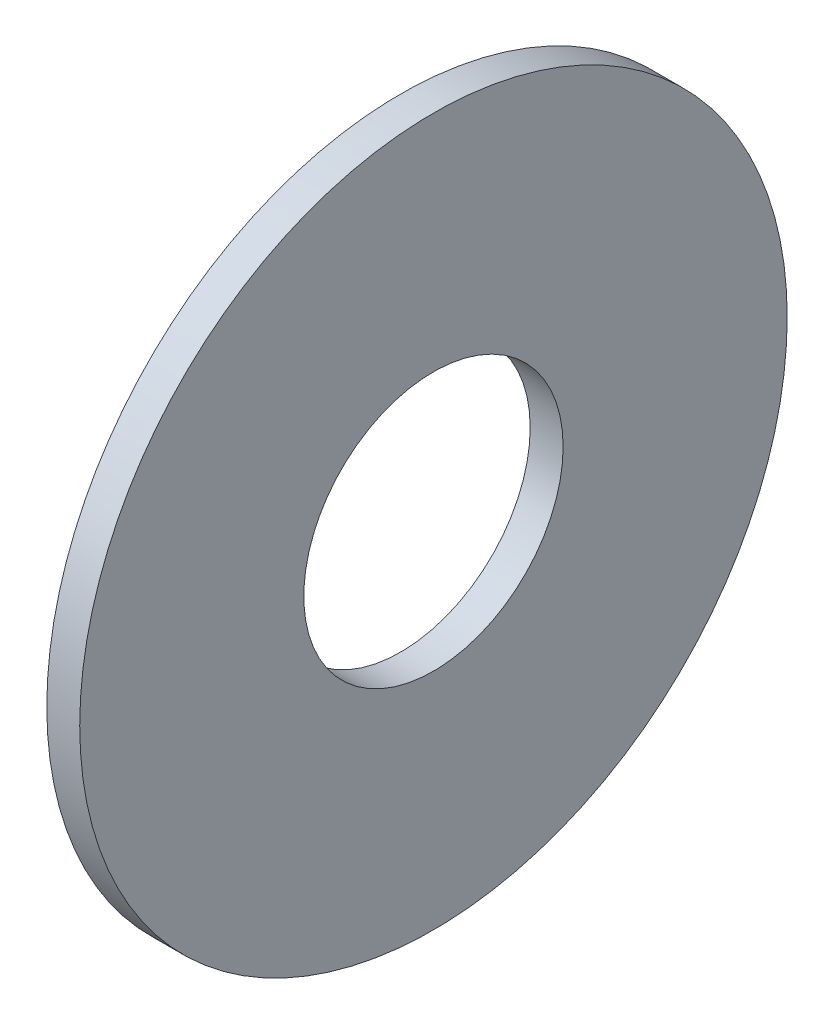
ISO-10303-21;
HEADER;
FILE_DESCRIPTION(('STEP AP214'),'2;1');
FILE_NAME('part.step','',(''),(''),'','','');
FILE_SCHEMA(('AUTOMOTIVE_DESIGN { 1 0 10303 214 1 1 1 1 }'));
ENDSEC;
DATA;
#1=APPLICATION_CONTEXT('core data for automotive mechanical design processes');
#2=APPLICATION_PROTOCOL_DEFINITION('international standard','automotive_design',2000,#1);
#3=PRODUCT_CONTEXT('',#1,'mechanical');
#4=PRODUCT('Part','Part','',(#3));
#5=PRODUCT_RELATED_PRODUCT_CATEGORY('part','',(#4));
#6=PRODUCT_DEFINITION_FORMATION('','',#4);
#7=PRODUCT_DEFINITION_CONTEXT('part definition',#1,'design');
#8=PRODUCT_DEFINITION('design','',#6,#7);
#9=PRODUCT_DEFINITION_SHAPE('','',#8);
#10=(LENGTH_UNIT() NAMED_UNIT(*) SI_UNIT(.MILLI.,.METRE.));
#11=(NAMED_UNIT(*) PLANE_ANGLE_UNIT() SI_UNIT($,.RADIAN.));
#12=(NAMED_UNIT(*) SI_UNIT($,.STERADIAN.) SOLID_ANGLE_UNIT());
#13=UNCERTAINTY_MEASURE_WITH_UNIT(LENGTH_MEASURE(1.E-05),#10,'distance_accuracy_value','');
#14=(GEOMETRIC_REPRESENTATION_CONTEXT(3) GLOBAL_UNCERTAINTY_ASSIGNED_CONTEXT((#13)) GLOBAL_UNIT_ASSIGNED_CONTEXT((#10,
#11,#12)) REPRESENTATION_CONTEXT('',''));
#15=CARTESIAN_POINT('',(0.,0.,0.));
#16=DIRECTION('',(0.,0.,1.));
#17=DIRECTION('',(1.,0.,0.));
#18=AXIS2_PLACEMENT_3D('',#15,#16,#17);
#19=CARTESIAN_POINT('',(0.8128,0.,0.));
#20=DIRECTION('',(1.,0.,0.));
#21=DIRECTION('',(0.,0.,-1.));
#22=AXIS2_PLACEMENT_3D('',#19,#20,#21);
#23=PLANE('',#22);
#24=CARTESIAN_POINT('',(0.8128,0.,0.));
#25=DIRECTION('',(1.,0.,0.));
#26=DIRECTION('',(0.,0.,-1.));
#27=AXIS2_PLACEMENT_3D('',#24,#25,#26);
#28=CIRCLE('',#27,8.73125);
#29=CARTESIAN_POINT('',(0.8128,0.,-8.73125));
#30=VERTEX_POINT('',#29);
#31=EDGE_CURVE('E10',#30,#30,#28,.T.);
#32=ORIENTED_EDGE('',*,*,#31,.T.);
#33=EDGE_LOOP('',(#32));
#34=FACE_BOUND('',#33,.T.);
#35=CARTESIAN_POINT('',(0.8128,0.,0.));
#36=DIRECTION('',(1.,0.,0.));
#37=DIRECTION('',(0.,0.,-1.));
#38=AXIS2_PLACEMENT_3D('',#35,#36,#37);
#39=CIRCLE('',#38,3.2004);
#40=CARTESIAN_POINT('',(0.8128,0.,-3.2004));
#41=VERTEX_POINT('',#40);
#42=EDGE_CURVE('E45',#41,#41,#39,.T.);
#43=ORIENTED_EDGE('',*,*,#42,.F.);
#44=EDGE_LOOP('',(#43));
#45=FACE_BOUND('',#44,.T.);
#46=ADVANCED_FACE('F34',(#34,#45),#23,.T.);
#47=CARTESIAN_POINT('',(0.,0.,0.));
#48=DIRECTION('',(1.,0.,0.));
#49=DIRECTION('',(0.,0.,-1.));
#50=AXIS2_PLACEMENT_3D('',#47,#48,#49);
#51=PLANE('',#50);
#52=CARTESIAN_POINT('',(0.,0.,0.));
#53=DIRECTION('',(1.,0.,0.));
#54=DIRECTION('',(0.,0.,-1.));
#55=AXIS2_PLACEMENT_3D('',#52,#53,#54);
#56=CIRCLE('',#55,8.73125);
#57=CARTESIAN_POINT('',(0.,0.,-8.73125));
#58=VERTEX_POINT('',#57);
#59=EDGE_CURVE('E38',#58,#58,#56,.T.);
#60=ORIENTED_EDGE('',*,*,#59,.F.);
#61=EDGE_LOOP('',(#60));
#62=FACE_BOUND('',#61,.T.);
#63=CARTESIAN_POINT('',(0.,0.,0.));
#64=DIRECTION('',(1.,0.,0.));
#65=DIRECTION('',(0.,0.,-1.));
#66=AXIS2_PLACEMENT_3D('',#63,#64,#65);
#67=CIRCLE('',#66,3.2004);
#68=CARTESIAN_POINT('',(0.,0.,-3.2004));
#69=VERTEX_POINT('',#68);
#70=EDGE_CURVE('E47',#69,#69,#67,.T.);
#71=ORIENTED_EDGE('',*,*,#70,.T.);
#72=EDGE_LOOP('',(#71));
#73=FACE_BOUND('',#72,.T.);
#74=ADVANCED_FACE('F57',(#62,#73),#51,.F.);
#75=CARTESIAN_POINT('',(0.8128,0.,0.));
#76=DIRECTION('',(-1.,0.,0.));
#77=DIRECTION('',(0.,0.,1.));
#78=AXIS2_PLACEMENT_3D('',#75,#76,#77);
#79=CYLINDRICAL_SURFACE('',#78,8.73125);
#80=ORIENTED_EDGE('',*,*,#31,.F.);
#81=EDGE_LOOP('',(#80));
#82=FACE_BOUND('',#81,.T.);
#83=ORIENTED_EDGE('',*,*,#59,.T.);
#84=EDGE_LOOP('',(#83));
#85=FACE_BOUND('',#84,.T.);
#86=ADVANCED_FACE('F36',(#82,#85),#79,.T.);
#87=CARTESIAN_POINT('',(0.8128,0.,0.));
#88=DIRECTION('',(-1.,0.,0.));
#89=DIRECTION('',(0.,0.,1.));
#90=AXIS2_PLACEMENT_3D('',#87,#88,#89);
#91=CYLINDRICAL_SURFACE('',#90,3.2004);
#92=ORIENTED_EDGE('',*,*,#42,.T.);
#93=EDGE_LOOP('',(#92));
#94=FACE_BOUND('',#93,.T.);
#95=ORIENTED_EDGE('',*,*,#70,.F.);
#96=EDGE_LOOP('',(#95));
#97=FACE_BOUND('',#96,.T.);
#98=ADVANCED_FACE('F53',(#94,#97),#91,.F.);
#99=CLOSED_SHELL('',(#46,#74,#86,#98));
#100=MANIFOLD_SOLID_BREP('B2',#99);
#101=ADVANCED_BREP_SHAPE_REPRESENTATION('',(#18,#100),#14);
#102=SHAPE_DEFINITION_REPRESENTATION(#9,#101);
ENDSEC;
END-ISO-10303-21;
